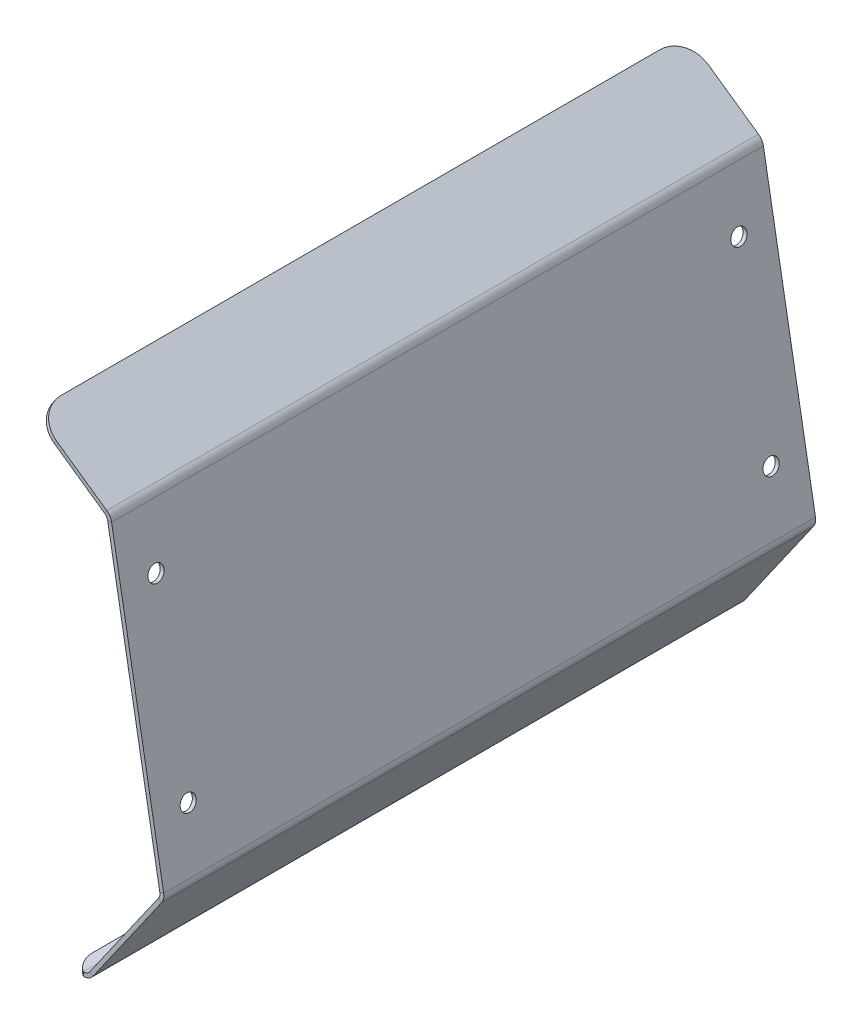
ISO-10303-21;
HEADER;
FILE_DESCRIPTION(('STEP AP214'),'2;1');
FILE_NAME('part.step','',(''),(''),'','','');
FILE_SCHEMA(('AUTOMOTIVE_DESIGN { 1 0 10303 214 1 1 1 1 }'));
ENDSEC;
DATA;
#1=APPLICATION_CONTEXT('core data for automotive mechanical design processes');
#2=APPLICATION_PROTOCOL_DEFINITION('international standard','automotive_design',2000,#1);
#3=PRODUCT_CONTEXT('',#1,'mechanical');
#4=PRODUCT('Part','Part','',(#3));
#5=PRODUCT_RELATED_PRODUCT_CATEGORY('part','',(#4));
#6=PRODUCT_DEFINITION_FORMATION('','',#4);
#7=PRODUCT_DEFINITION_CONTEXT('part definition',#1,'design');
#8=PRODUCT_DEFINITION('design','',#6,#7);
#9=PRODUCT_DEFINITION_SHAPE('','',#8);
#10=(LENGTH_UNIT() NAMED_UNIT(*) SI_UNIT(.MILLI.,.METRE.));
#11=(NAMED_UNIT(*) PLANE_ANGLE_UNIT() SI_UNIT($,.RADIAN.));
#12=(NAMED_UNIT(*) SI_UNIT($,.STERADIAN.) SOLID_ANGLE_UNIT());
#13=UNCERTAINTY_MEASURE_WITH_UNIT(LENGTH_MEASURE(1.E-05),#10,'distance_accuracy_value','');
#14=(GEOMETRIC_REPRESENTATION_CONTEXT(3) GLOBAL_UNCERTAINTY_ASSIGNED_CONTEXT((#13)) GLOBAL_UNIT_ASSIGNED_CONTEXT((#10,
#11,#12)) REPRESENTATION_CONTEXT('',''));
#15=CARTESIAN_POINT('',(0.,0.,0.));
#16=DIRECTION('',(0.,0.,1.));
#17=DIRECTION('',(1.,0.,0.));
#18=AXIS2_PLACEMENT_3D('',#15,#16,#17);
#19=CARTESIAN_POINT('',(148.405860086006,77.6823649230071,245.999999999999));
#20=DIRECTION('',(0.,0.,1.));
#21=DIRECTION('',(1.,0.,0.));
#22=AXIS2_PLACEMENT_3D('',#19,#20,#21);
#23=PLANE('',#22);
#24=DIRECTION('',(0.573576436351058,0.819152044288983,0.));
#25=VECTOR('',#24,1.);
#26=CARTESIAN_POINT('',(148.405860086006,77.6823649230071,245.999999999999));
#27=LINE('',#26,#25);
#28=CARTESIAN_POINT('',(148.405860086006,77.6823649230071,245.999999999999));
#29=VERTEX_POINT('',#28);
#30=CARTESIAN_POINT('',(149.266224740533,78.9110929894406,245.999999999999));
#31=VERTEX_POINT('',#30);
#32=EDGE_CURVE('E328',#29,#31,#27,.T.);
#33=ORIENTED_EDGE('',*,*,#32,.F.);
#34=CARTESIAN_POINT('',(146.685130776953,75.2249087901402,245.999999999999));
#35=DIRECTION('',(0.,0.,1.));
#36=DIRECTION('',(1.,0.,0.));
#37=AXIS2_PLACEMENT_3D('',#34,#35,#36);
#38=CIRCLE('',#37,3.);
#39=CARTESIAN_POINT('',(149.63955403599,75.745853323141,245.999999999999));
#40=VERTEX_POINT('',#39);
#41=EDGE_CURVE('E394',#29,#40,#38,.F.);
#42=ORIENTED_EDGE('',*,*,#41,.T.);
#43=DIRECTION('',(-0.984807753012202,-0.173648177666963,0.));
#44=VECTOR('',#43,1.);
#45=CARTESIAN_POINT('',(151.116765665508,76.0063255896414,245.999999999999));
#46=LINE('',#45,#44);
#47=CARTESIAN_POINT('',(151.116765665508,76.0063255896414,245.999999999999));
#48=VERTEX_POINT('',#47);
#49=EDGE_CURVE('E325',#48,#40,#46,.T.);
#50=ORIENTED_EDGE('',*,*,#49,.F.);
#51=CARTESIAN_POINT('',(146.685130776953,75.2249087901402,245.999999999999));
#52=DIRECTION('',(0.,0.,1.));
#53=DIRECTION('',(1.,0.,0.));
#54=AXIS2_PLACEMENT_3D('',#51,#52,#53);
#55=CIRCLE('',#54,4.5);
#56=EDGE_CURVE('E470',#31,#48,#55,.F.);
#57=ORIENTED_EDGE('',*,*,#56,.F.);
#58=EDGE_LOOP('',(#33,#42,#50,#57));
#59=FACE_BOUND('',#58,.T.);
#60=ADVANCED_FACE('F41',(#59),#23,.T.);
#61=CARTESIAN_POINT('',(151.116765665508,76.0063255896414,245.999999999999));
#62=DIRECTION('',(0.,0.,1.));
#63=DIRECTION('',(1.,0.,0.));
#64=AXIS2_PLACEMENT_3D('',#61,#62,#63);
#65=PLANE('',#64);
#66=DIRECTION('',(0.819152044288987,-0.573576436351053,0.));
#67=VECTOR('',#66,1.);
#68=CARTESIAN_POINT('',(150.284136399703,78.1983435724579,245.999999999999));
#69=LINE('',#68,#67);
#70=CARTESIAN_POINT('',(130.259993063085,92.2193996829498,245.999999999999));
#71=VERTEX_POINT('',#70);
#72=EDGE_CURVE('E553',#71,#31,#69,.T.);
#73=ORIENTED_EDGE('',*,*,#72,.F.);
#74=DIRECTION('',(0.57357643635105,0.819152044288989,0.));
#75=VECTOR('',#74,1.);
#76=CARTESIAN_POINT('',(129.504008144032,91.1397413276773,245.999999999999));
#77=LINE('',#76,#75);
#78=CARTESIAN_POINT('',(129.399628408559,90.9906716165163,245.999999999999));
#79=VERTEX_POINT('',#78);
#80=EDGE_CURVE('E11',#71,#79,#77,.F.);
#81=ORIENTED_EDGE('',*,*,#80,.T.);
#82=DIRECTION('',(0.819152044288987,-0.573576436351053,0.));
#83=VECTOR('',#82,1.);
#84=CARTESIAN_POINT('',(149.423771745177,76.9696155060244,245.999999999999));
#85=LINE('',#84,#83);
#86=EDGE_CURVE('E492',#79,#29,#85,.T.);
#87=ORIENTED_EDGE('',*,*,#86,.T.);
#88=ORIENTED_EDGE('',*,*,#32,.T.);
#89=EDGE_LOOP('',(#73,#81,#87,#88));
#90=FACE_BOUND('',#89,.T.);
#91=ADVANCED_FACE('F526',(#90),#65,.T.);
#92=CARTESIAN_POINT('',(149.63955403599,75.745853323141,0.));
#93=DIRECTION('',(0.,0.,-1.));
#94=DIRECTION('',(-1.,0.,0.));
#95=AXIS2_PLACEMENT_3D('',#92,#93,#94);
#96=PLANE('',#95);
#97=DIRECTION('',(0.984807753012202,0.173648177666963,0.));
#98=VECTOR('',#97,1.);
#99=CARTESIAN_POINT('',(149.63955403599,75.745853323141,0.));
#100=LINE('',#99,#98);
#101=CARTESIAN_POINT('',(149.63955403599,75.745853323141,0.));
#102=VERTEX_POINT('',#101);
#103=CARTESIAN_POINT('',(151.116765665508,76.0063255896414,0.));
#104=VERTEX_POINT('',#103);
#105=EDGE_CURVE('E322',#102,#104,#100,.T.);
#106=ORIENTED_EDGE('',*,*,#105,.F.);
#107=CARTESIAN_POINT('',(146.685130776953,75.2249087901402,0.));
#108=DIRECTION('',(0.,0.,1.));
#109=DIRECTION('',(1.,0.,0.));
#110=AXIS2_PLACEMENT_3D('',#107,#108,#109);
#111=CIRCLE('',#110,3.);
#112=CARTESIAN_POINT('',(148.405860086006,77.6823649230071,0.));
#113=VERTEX_POINT('',#112);
#114=EDGE_CURVE('E258',#113,#102,#111,.F.);
#115=ORIENTED_EDGE('',*,*,#114,.F.);
#116=DIRECTION('',(-0.573576436351058,-0.819152044288983,0.));
#117=VECTOR('',#116,1.);
#118=CARTESIAN_POINT('',(149.266224740533,78.9110929894406,0.));
#119=LINE('',#118,#117);
#120=CARTESIAN_POINT('',(149.266224740533,78.9110929894406,0.));
#121=VERTEX_POINT('',#120);
#122=EDGE_CURVE('E255',#121,#113,#119,.T.);
#123=ORIENTED_EDGE('',*,*,#122,.F.);
#124=CARTESIAN_POINT('',(146.685130776953,75.2249087901402,0.));
#125=DIRECTION('',(0.,0.,1.));
#126=DIRECTION('',(1.,0.,0.));
#127=AXIS2_PLACEMENT_3D('',#124,#125,#126);
#128=CIRCLE('',#127,4.5);
#129=EDGE_CURVE('E453',#121,#104,#128,.F.);
#130=ORIENTED_EDGE('',*,*,#129,.T.);
#131=EDGE_LOOP('',(#106,#115,#123,#130));
#132=FACE_BOUND('',#131,.T.);
#133=ADVANCED_FACE('F396',(#132),#96,.T.);
#134=CARTESIAN_POINT('',(149.266224740533,78.9110929894406,0.));
#135=DIRECTION('',(0.,0.,-1.));
#136=DIRECTION('',(-1.,0.,0.));
#137=AXIS2_PLACEMENT_3D('',#134,#135,#136);
#138=PLANE('',#137);
#139=DIRECTION('',(0.173648177667033,-0.98480775301219,0.));
#140=VECTOR('',#139,1.);
#141=CARTESIAN_POINT('',(169.167035978442,-34.9999999999999,0.));
#142=LINE('',#141,#140);
#143=CARTESIAN_POINT('',(169.298550042963,-35.7458533231406,0.));
#144=VERTEX_POINT('',#143);
#145=EDGE_CURVE('E400',#102,#144,#142,.T.);
#146=ORIENTED_EDGE('',*,*,#145,.F.);
#147=ORIENTED_EDGE('',*,*,#105,.T.);
#148=DIRECTION('',(0.173648177666931,-0.984807753012208,0.));
#149=VECTOR('',#148,1.);
#150=CARTESIAN_POINT('',(170.64424760796,-34.7395277334995,0.));
#151=LINE('',#150,#149);
#152=CARTESIAN_POINT('',(170.775761672481,-35.4853810566401,0.));
#153=VERTEX_POINT('',#152);
#154=EDGE_CURVE('E449',#104,#153,#151,.T.);
#155=ORIENTED_EDGE('',*,*,#154,.T.);
#156=DIRECTION('',(-0.98480775301219,-0.173648177667033,0.));
#157=VECTOR('',#156,1.);
#158=CARTESIAN_POINT('',(170.775761672481,-35.4853810566401,0.));
#159=LINE('',#158,#157);
#160=EDGE_CURVE('E308',#153,#144,#159,.T.);
#161=ORIENTED_EDGE('',*,*,#160,.T.);
#162=EDGE_LOOP('',(#146,#147,#155,#161));
#163=FACE_BOUND('',#162,.T.);
#164=ADVANCED_FACE('F477',(#163),#138,.T.);
#165=CARTESIAN_POINT('',(169.298550042963,-35.7458533231406,245.999999999999));
#166=DIRECTION('',(0.,0.,1.));
#167=DIRECTION('',(1.,0.,0.));
#168=AXIS2_PLACEMENT_3D('',#165,#166,#167);
#169=PLANE('',#168);
#170=DIRECTION('',(0.98480775301219,0.173648177667033,0.));
#171=VECTOR('',#170,1.);
#172=CARTESIAN_POINT('',(169.298550042963,-35.7458533231406,245.999999999999));
#173=LINE('',#172,#171);
#174=CARTESIAN_POINT('',(169.298550042963,-35.7458533231406,245.999999999999));
#175=VERTEX_POINT('',#174);
#176=CARTESIAN_POINT('',(170.775761672481,-35.4853810566401,245.999999999999));
#177=VERTEX_POINT('',#176);
#178=EDGE_CURVE('E317',#175,#177,#173,.T.);
#179=ORIENTED_EDGE('',*,*,#178,.F.);
#180=CARTESIAN_POINT('',(166.344126783926,-36.2667978561417,245.999999999999));
#181=DIRECTION('',(0.,0.,1.));
#182=DIRECTION('',(1.,0.,0.));
#183=AXIS2_PLACEMENT_3D('',#180,#181,#182);
#184=CIRCLE('',#183,3.);
#185=CARTESIAN_POINT('',(168.801582916793,-37.9875271651948,245.999999999999));
#186=VERTEX_POINT('',#185);
#187=EDGE_CURVE('E485',#175,#186,#184,.F.);
#188=ORIENTED_EDGE('',*,*,#187,.T.);
#189=DIRECTION('',(-0.819152044288993,0.573576436351044,0.));
#190=VECTOR('',#189,1.);
#191=CARTESIAN_POINT('',(170.030310983227,-38.8478918197214,245.999999999999));
#192=LINE('',#191,#190);
#193=CARTESIAN_POINT('',(170.030310983227,-38.8478918197214,245.999999999999));
#194=VERTEX_POINT('',#193);
#195=EDGE_CURVE('E314',#194,#186,#192,.T.);
#196=ORIENTED_EDGE('',*,*,#195,.F.);
#197=CARTESIAN_POINT('',(166.344126783926,-36.2667978561417,245.999999999999));
#198=DIRECTION('',(0.,0.,1.));
#199=DIRECTION('',(1.,0.,0.));
#200=AXIS2_PLACEMENT_3D('',#197,#198,#199);
#201=CIRCLE('',#200,4.5);
#202=EDGE_CURVE('E510',#177,#194,#201,.F.);
#203=ORIENTED_EDGE('',*,*,#202,.F.);
#204=EDGE_LOOP('',(#179,#188,#196,#203));
#205=FACE_BOUND('',#204,.T.);
#206=ADVANCED_FACE('F509',(#205),#169,.T.);
#207=CARTESIAN_POINT('',(170.030310983227,-38.8478918197214,245.999999999999));
#208=DIRECTION('',(0.,0.,1.));
#209=DIRECTION('',(1.,0.,0.));
#210=AXIS2_PLACEMENT_3D('',#207,#208,#209);
#211=PLANE('',#210);
#212=DIRECTION('',(0.173648177666931,-0.984807753012208,0.));
#213=VECTOR('',#212,1.);
#214=CARTESIAN_POINT('',(169.167035978442,-34.9999999999999,245.999999999999));
#215=LINE('',#214,#213);
#216=EDGE_CURVE('E482',#40,#175,#215,.T.);
#217=ORIENTED_EDGE('',*,*,#216,.T.);
#218=ORIENTED_EDGE('',*,*,#178,.T.);
#219=DIRECTION('',(0.173648177667033,-0.98480775301219,0.));
#220=VECTOR('',#219,1.);
#221=CARTESIAN_POINT('',(170.64424760796,-34.7395277334993,245.999999999999));
#222=LINE('',#221,#220);
#223=EDGE_CURVE('E513',#48,#177,#222,.T.);
#224=ORIENTED_EDGE('',*,*,#223,.F.);
#225=ORIENTED_EDGE('',*,*,#49,.T.);
#226=EDGE_LOOP('',(#217,#218,#224,#225));
#227=FACE_BOUND('',#226,.T.);
#228=ADVANCED_FACE('F512',(#227),#211,.T.);
#229=CARTESIAN_POINT('',(168.801582916793,-37.9875271651948,0.));
#230=DIRECTION('',(0.,0.,-1.));
#231=DIRECTION('',(-1.,0.,0.));
#232=AXIS2_PLACEMENT_3D('',#229,#230,#231);
#233=PLANE('',#232);
#234=DIRECTION('',(0.819152044288993,-0.573576436351044,0.));
#235=VECTOR('',#234,1.);
#236=CARTESIAN_POINT('',(168.801582916793,-37.9875271651948,0.));
#237=LINE('',#236,#235);
#238=CARTESIAN_POINT('',(168.801582916793,-37.9875271651948,0.));
#239=VERTEX_POINT('',#238);
#240=CARTESIAN_POINT('',(170.030310983227,-38.8478918197214,0.));
#241=VERTEX_POINT('',#240);
#242=EDGE_CURVE('E311',#239,#241,#237,.T.);
#243=ORIENTED_EDGE('',*,*,#242,.F.);
#244=CARTESIAN_POINT('',(166.344126783926,-36.2667978561417,0.));
#245=DIRECTION('',(0.,0.,1.));
#246=DIRECTION('',(1.,0.,0.));
#247=AXIS2_PLACEMENT_3D('',#244,#245,#246);
#248=CIRCLE('',#247,3.);
#249=EDGE_CURVE('E366',#144,#239,#248,.F.);
#250=ORIENTED_EDGE('',*,*,#249,.F.);
#251=ORIENTED_EDGE('',*,*,#160,.F.);
#252=CARTESIAN_POINT('',(166.344126783926,-36.2667978561417,0.));
#253=DIRECTION('',(0.,0.,1.));
#254=DIRECTION('',(1.,0.,0.));
#255=AXIS2_PLACEMENT_3D('',#252,#253,#254);
#256=CIRCLE('',#255,4.5);
#257=EDGE_CURVE('E439',#153,#241,#256,.F.);
#258=ORIENTED_EDGE('',*,*,#257,.T.);
#259=EDGE_LOOP('',(#243,#250,#251,#258));
#260=FACE_BOUND('',#259,.T.);
#261=ADVANCED_FACE('F516',(#260),#233,.T.);
#262=CARTESIAN_POINT('',(170.775761672481,-35.4853810566401,0.));
#263=DIRECTION('',(0.,0.,-1.));
#264=DIRECTION('',(-1.,0.,0.));
#265=AXIS2_PLACEMENT_3D('',#262,#263,#264);
#266=PLANE('',#265);
#267=DIRECTION('',(-0.573576436351041,-0.819152044288995,0.));
#268=VECTOR('',#267,1.);
#269=CARTESIAN_POINT('',(169.514332333776,-36.9696155060243,0.));
#270=LINE('',#269,#268);
#271=CARTESIAN_POINT('',(142.901222697,-74.977074986995,0.));
#272=VERTEX_POINT('',#271);
#273=EDGE_CURVE('E361',#239,#272,#270,.T.);
#274=ORIENTED_EDGE('',*,*,#273,.F.);
#275=ORIENTED_EDGE('',*,*,#242,.T.);
#276=DIRECTION('',(-0.573576436351041,-0.819152044288995,0.));
#277=VECTOR('',#276,1.);
#278=CARTESIAN_POINT('',(170.743060400209,-37.8299801605508,0.));
#279=LINE('',#278,#277);
#280=CARTESIAN_POINT('',(144.129950763434,-75.8374396415216,0.));
#281=VERTEX_POINT('',#280);
#282=EDGE_CURVE('E427',#241,#281,#279,.T.);
#283=ORIENTED_EDGE('',*,*,#282,.T.);
#284=DIRECTION('',(-0.819152044288993,0.573576436351044,0.));
#285=VECTOR('',#284,1.);
#286=CARTESIAN_POINT('',(144.129950763434,-75.8374396415216,0.));
#287=LINE('',#286,#285);
#288=EDGE_CURVE('E300',#281,#272,#287,.T.);
#289=ORIENTED_EDGE('',*,*,#288,.T.);
#290=EDGE_LOOP('',(#274,#275,#283,#289));
#291=FACE_BOUND('',#290,.T.);
#292=ADVANCED_FACE('F424',(#291),#266,.T.);
#293=CARTESIAN_POINT('',(142.901222697,-74.977074986995,245.999999999999));
#294=DIRECTION('',(0.,0.,1.));
#295=DIRECTION('',(1.,0.,0.));
#296=AXIS2_PLACEMENT_3D('',#293,#294,#295);
#297=PLANE('',#296);
#298=DIRECTION('',(0.819152044288993,-0.573576436351044,0.));
#299=VECTOR('',#298,1.);
#300=CARTESIAN_POINT('',(142.901222697,-74.977074986995,245.999999999999));
#301=LINE('',#300,#299);
#302=CARTESIAN_POINT('',(142.901222697,-74.977074986995,245.999999999999));
#303=VERTEX_POINT('',#302);
#304=CARTESIAN_POINT('',(144.129950763434,-75.8374396415216,245.999999999999));
#305=VERTEX_POINT('',#304);
#306=EDGE_CURVE('E181',#303,#305,#301,.T.);
#307=ORIENTED_EDGE('',*,*,#306,.F.);
#308=CARTESIAN_POINT('',(140.443766564133,-73.2563456779419,245.999999999999));
#309=DIRECTION('',(0.,0.,1.));
#310=DIRECTION('',(1.,0.,0.));
#311=AXIS2_PLACEMENT_3D('',#308,#309,#310);
#312=CIRCLE('',#311,3.);
#313=CARTESIAN_POINT('',(140.443766564133,-76.2563456779419,245.999999999999));
#314=VERTEX_POINT('',#313);
#315=EDGE_CURVE('E176',#303,#314,#312,.F.);
#316=ORIENTED_EDGE('',*,*,#315,.T.);
#317=DIRECTION('',(0.,1.,0.));
#318=VECTOR('',#317,1.);
#319=CARTESIAN_POINT('',(140.443766564133,-77.7563456779419,245.999999999999));
#320=LINE('',#319,#318);
#321=CARTESIAN_POINT('',(140.443766564133,-77.7563456779419,245.999999999999));
#322=VERTEX_POINT('',#321);
#323=EDGE_CURVE('E169',#322,#314,#320,.T.);
#324=ORIENTED_EDGE('',*,*,#323,.F.);
#325=CARTESIAN_POINT('',(140.443766564133,-73.2563456779419,245.999999999999));
#326=DIRECTION('',(0.,0.,1.));
#327=DIRECTION('',(1.,0.,0.));
#328=AXIS2_PLACEMENT_3D('',#325,#326,#327);
#329=CIRCLE('',#328,4.5);
#330=EDGE_CURVE('E173',#305,#322,#329,.F.);
#331=ORIENTED_EDGE('',*,*,#330,.F.);
#332=EDGE_LOOP('',(#307,#316,#324,#331));
#333=FACE_BOUND('',#332,.T.);
#334=ADVANCED_FACE('F171',(#333),#297,.T.);
#335=CARTESIAN_POINT('',(140.443766564133,-77.7563456779419,245.999999999999));
#336=DIRECTION('',(0.,0.,1.));
#337=DIRECTION('',(1.,0.,0.));
#338=AXIS2_PLACEMENT_3D('',#335,#336,#337);
#339=PLANE('',#338);
#340=DIRECTION('',(-0.573576436351041,-0.819152044288995,0.));
#341=VECTOR('',#340,1.);
#342=CARTESIAN_POINT('',(169.514332333776,-36.9696155060243,245.999999999999));
#343=LINE('',#342,#341);
#344=EDGE_CURVE('E422',#186,#303,#343,.T.);
#345=ORIENTED_EDGE('',*,*,#344,.T.);
#346=ORIENTED_EDGE('',*,*,#306,.T.);
#347=DIRECTION('',(-0.573576436351041,-0.819152044288995,0.));
#348=VECTOR('',#347,1.);
#349=CARTESIAN_POINT('',(170.743060400209,-37.8299801605508,245.999999999999));
#350=LINE('',#349,#348);
#351=EDGE_CURVE('E204',#194,#305,#350,.T.);
#352=ORIENTED_EDGE('',*,*,#351,.F.);
#353=ORIENTED_EDGE('',*,*,#195,.T.);
#354=EDGE_LOOP('',(#345,#346,#352,#353));
#355=FACE_BOUND('',#354,.T.);
#356=ADVANCED_FACE('F505',(#355),#339,.T.);
#357=CARTESIAN_POINT('',(140.443766564133,-76.2563456779419,0.));
#358=DIRECTION('',(0.,0.,-1.));
#359=DIRECTION('',(-1.,0.,0.));
#360=AXIS2_PLACEMENT_3D('',#357,#358,#359);
#361=PLANE('',#360);
#362=DIRECTION('',(0.,-1.,0.));
#363=VECTOR('',#362,1.);
#364=CARTESIAN_POINT('',(140.443766564133,-76.2563456779419,0.));
#365=LINE('',#364,#363);
#366=CARTESIAN_POINT('',(140.443766564133,-76.2563456779419,0.));
#367=VERTEX_POINT('',#366);
#368=CARTESIAN_POINT('',(140.443766564133,-77.7563456779419,0.));
#369=VERTEX_POINT('',#368);
#370=EDGE_CURVE('E182',#367,#369,#365,.T.);
#371=ORIENTED_EDGE('',*,*,#370,.F.);
#372=CARTESIAN_POINT('',(140.443766564133,-73.2563456779419,0.));
#373=DIRECTION('',(0.,0.,1.));
#374=DIRECTION('',(1.,0.,0.));
#375=AXIS2_PLACEMENT_3D('',#372,#373,#374);
#376=CIRCLE('',#375,3.);
#377=EDGE_CURVE('E205',#272,#367,#376,.F.);
#378=ORIENTED_EDGE('',*,*,#377,.F.);
#379=ORIENTED_EDGE('',*,*,#288,.F.);
#380=CARTESIAN_POINT('',(140.443766564133,-73.2563456779419,0.));
#381=DIRECTION('',(0.,0.,1.));
#382=DIRECTION('',(1.,0.,0.));
#383=AXIS2_PLACEMENT_3D('',#380,#381,#382);
#384=CIRCLE('',#383,4.5);
#385=EDGE_CURVE('E354',#281,#369,#384,.F.);
#386=ORIENTED_EDGE('',*,*,#385,.T.);
#387=EDGE_LOOP('',(#371,#378,#379,#386));
#388=FACE_BOUND('',#387,.T.);
#389=ADVANCED_FACE('F353',(#388),#361,.T.);
#390=CARTESIAN_POINT('',(142.005467715789,-76.2563456779419,245.999999999999));
#391=DIRECTION('',(0.,-1.,0.));
#392=DIRECTION('',(1.,0.,0.));
#393=AXIS2_PLACEMENT_3D('',#390,#391,#392);
#394=PLANE('',#393);
#395=DIRECTION('',(0.,0.,-1.));
#396=VECTOR('',#395,1.);
#397=CARTESIAN_POINT('',(140.443766564133,-76.2563456779419,245.999999999999));
#398=LINE('',#397,#396);
#399=EDGE_CURVE('E346',#314,#367,#398,.T.);
#400=ORIENTED_EDGE('',*,*,#399,.T.);
#401=CARTESIAN_POINT('',(145.953063944536,-76.2563456779418,8.34551630363785));
#402=DIRECTION('',(0.,-1.,0.));
#403=DIRECTION('',(1.,0.,0.));
#404=AXIS2_PLACEMENT_3D('',#401,#402,#403);
#405=CIRCLE('',#404,10.);
#406=CARTESIAN_POINT('',(135.953063944536,-76.2563456779419,8.34551630363783));
#407=VERTEX_POINT('',#406);
#408=EDGE_CURVE('E335',#367,#407,#405,.F.);
#409=ORIENTED_EDGE('',*,*,#408,.T.);
#410=DIRECTION('',(0.,0.,-1.));
#411=VECTOR('',#410,1.);
#412=CARTESIAN_POINT('',(135.953063944536,-76.2563456779419,245.999999999999));
#413=LINE('',#412,#411);
#414=CARTESIAN_POINT('',(135.953063944536,-76.2563456779419,237.654483696361));
#415=VERTEX_POINT('',#414);
#416=EDGE_CURVE('E296',#415,#407,#413,.T.);
#417=ORIENTED_EDGE('',*,*,#416,.F.);
#418=CARTESIAN_POINT('',(145.953063944536,-76.2563456779418,237.654483696361));
#419=DIRECTION('',(0.,-1.,0.));
#420=DIRECTION('',(1.,0.,0.));
#421=AXIS2_PLACEMENT_3D('',#418,#419,#420);
#422=CIRCLE('',#421,10.);
#423=EDGE_CURVE('E332',#415,#314,#422,.F.);
#424=ORIENTED_EDGE('',*,*,#423,.T.);
#425=EDGE_LOOP('',(#400,#409,#417,#424));
#426=FACE_BOUND('',#425,.T.);
#427=ADVANCED_FACE('F345',(#426),#394,.F.);
#428=CARTESIAN_POINT('',(135.953063944536,-77.7563456779419,245.999999999999));
#429=DIRECTION('',(-1.,0.,0.));
#430=DIRECTION('',(0.,0.,1.));
#431=AXIS2_PLACEMENT_3D('',#428,#429,#430);
#432=PLANE('',#431);
#433=ORIENTED_EDGE('',*,*,#416,.T.);
#434=DIRECTION('',(0.,1.,0.));
#435=VECTOR('',#434,1.);
#436=CARTESIAN_POINT('',(135.953063944536,-77.7563456779419,8.34551630363785));
#437=LINE('',#436,#435);
#438=CARTESIAN_POINT('',(135.953063944536,-77.7563456779419,8.34551630363785));
#439=VERTEX_POINT('',#438);
#440=EDGE_CURVE('E212',#407,#439,#437,.F.);
#441=ORIENTED_EDGE('',*,*,#440,.T.);
#442=DIRECTION('',(0.,0.,-1.));
#443=VECTOR('',#442,1.);
#444=CARTESIAN_POINT('',(135.953063944536,-77.7563456779419,245.999999999999));
#445=LINE('',#444,#443);
#446=CARTESIAN_POINT('',(135.953063944536,-77.7563456779419,237.654483696361));
#447=VERTEX_POINT('',#446);
#448=EDGE_CURVE('E197',#447,#439,#445,.T.);
#449=ORIENTED_EDGE('',*,*,#448,.F.);
#450=DIRECTION('',(0.,-1.,0.));
#451=VECTOR('',#450,1.);
#452=CARTESIAN_POINT('',(135.953063944536,-76.2563456779419,237.654483696361));
#453=LINE('',#452,#451);
#454=EDGE_CURVE('E210',#447,#415,#453,.F.);
#455=ORIENTED_EDGE('',*,*,#454,.T.);
#456=EDGE_LOOP('',(#433,#441,#449,#455));
#457=FACE_BOUND('',#456,.T.);
#458=ADVANCED_FACE('F341',(#457),#432,.T.);
#459=CARTESIAN_POINT('',(142.005467715789,-77.7563456779419,245.999999999999));
#460=DIRECTION('',(0.,-1.,0.));
#461=DIRECTION('',(1.,0.,0.));
#462=AXIS2_PLACEMENT_3D('',#459,#460,#461);
#463=PLANE('',#462);
#464=ORIENTED_EDGE('',*,*,#448,.T.);
#465=CARTESIAN_POINT('',(145.953063944536,-77.7563456779418,8.34551630363785));
#466=DIRECTION('',(0.,-1.,0.));
#467=DIRECTION('',(1.,0.,0.));
#468=AXIS2_PLACEMENT_3D('',#465,#466,#467);
#469=CIRCLE('',#468,10.);
#470=EDGE_CURVE('E192',#439,#369,#469,.T.);
#471=ORIENTED_EDGE('',*,*,#470,.T.);
#472=DIRECTION('',(0.,0.,-1.));
#473=VECTOR('',#472,1.);
#474=CARTESIAN_POINT('',(140.443766564133,-77.7563456779419,245.999999999999));
#475=LINE('',#474,#473);
#476=EDGE_CURVE('E186',#322,#369,#475,.T.);
#477=ORIENTED_EDGE('',*,*,#476,.F.);
#478=CARTESIAN_POINT('',(145.953063944536,-77.7563456779418,237.654483696361));
#479=DIRECTION('',(0.,-1.,0.));
#480=DIRECTION('',(1.,0.,0.));
#481=AXIS2_PLACEMENT_3D('',#478,#479,#480);
#482=CIRCLE('',#481,10.);
#483=EDGE_CURVE('E189',#322,#447,#482,.T.);
#484=ORIENTED_EDGE('',*,*,#483,.T.);
#485=EDGE_LOOP('',(#464,#471,#477,#484));
#486=FACE_BOUND('',#485,.T.);
#487=ADVANCED_FACE('F188',(#486),#463,.T.);
#488=CARTESIAN_POINT('',(140.443766564133,-73.2563456779419,245.999999999999));
#489=DIRECTION('',(0.,0.,-1.));
#490=DIRECTION('',(-1.,0.,0.));
#491=AXIS2_PLACEMENT_3D('',#488,#489,#490);
#492=CYLINDRICAL_SURFACE('',#491,4.5);
#493=ORIENTED_EDGE('',*,*,#385,.F.);
#494=DIRECTION('',(0.,0.,-1.));
#495=VECTOR('',#494,1.);
#496=CARTESIAN_POINT('',(144.129950763434,-75.8374396415216,245.999999999999));
#497=LINE('',#496,#495);
#498=EDGE_CURVE('E198',#305,#281,#497,.T.);
#499=ORIENTED_EDGE('',*,*,#498,.F.);
#500=ORIENTED_EDGE('',*,*,#330,.T.);
#501=ORIENTED_EDGE('',*,*,#476,.T.);
#502=EDGE_LOOP('',(#493,#499,#500,#501));
#503=FACE_BOUND('',#502,.T.);
#504=ADVANCED_FACE('F201',(#503),#492,.T.);
#505=CARTESIAN_POINT('',(170.743060400209,-37.8299801605508,245.999999999999));
#506=DIRECTION('',(0.819152044288995,-0.573576436351041,0.));
#507=DIRECTION('',(0.573576436351041,0.819152044288995,0.));
#508=AXIS2_PLACEMENT_3D('',#505,#506,#507);
#509=PLANE('',#508);
#510=ORIENTED_EDGE('',*,*,#282,.F.);
#511=DIRECTION('',(0.,0.,-1.));
#512=VECTOR('',#511,1.);
#513=CARTESIAN_POINT('',(170.030310983227,-38.8478918197214,245.999999999999));
#514=LINE('',#513,#512);
#515=EDGE_CURVE('E288',#194,#241,#514,.T.);
#516=ORIENTED_EDGE('',*,*,#515,.F.);
#517=ORIENTED_EDGE('',*,*,#351,.T.);
#518=ORIENTED_EDGE('',*,*,#498,.T.);
#519=EDGE_LOOP('',(#510,#516,#517,#518));
#520=FACE_BOUND('',#519,.T.);
#521=ADVANCED_FACE('F429',(#520),#509,.T.);
#522=CARTESIAN_POINT('',(166.344126783926,-36.2667978561417,245.999999999999));
#523=DIRECTION('',(0.,0.,-1.));
#524=DIRECTION('',(-1.,0.,0.));
#525=AXIS2_PLACEMENT_3D('',#522,#523,#524);
#526=CYLINDRICAL_SURFACE('',#525,4.5);
#527=ORIENTED_EDGE('',*,*,#257,.F.);
#528=DIRECTION('',(0.,0.,-1.));
#529=VECTOR('',#528,1.);
#530=CARTESIAN_POINT('',(170.775761672481,-35.4853810566401,245.999999999999));
#531=LINE('',#530,#529);
#532=EDGE_CURVE('E284',#177,#153,#531,.T.);
#533=ORIENTED_EDGE('',*,*,#532,.F.);
#534=ORIENTED_EDGE('',*,*,#202,.T.);
#535=ORIENTED_EDGE('',*,*,#515,.T.);
#536=EDGE_LOOP('',(#527,#533,#534,#535));
#537=FACE_BOUND('',#536,.T.);
#538=ADVANCED_FACE('F515',(#537),#526,.T.);
#539=CARTESIAN_POINT('',(170.64424760796,-34.7395277334995,245.999999999999));
#540=DIRECTION('',(0.984807753012208,0.173648177666931,0.));
#541=DIRECTION('',(-0.173648177666931,0.984807753012208,0.));
#542=AXIS2_PLACEMENT_3D('',#539,#540,#541);
#543=PLANE('',#542);
#544=CARTESIAN_POINT('',(154.868577450652,54.728743621928,13.0000000000002));
#545=DIRECTION('',(0.984807753012208,0.173648177666931,0.));
#546=DIRECTION('',(-0.173648177666931,0.984807753012208,0.));
#547=AXIS2_PLACEMENT_3D('',#544,#545,#546);
#548=CIRCLE('',#547,3.);
#549=CARTESIAN_POINT('',(154.347632917651,57.6831668809646,13.0000000000002));
#550=VERTEX_POINT('',#549);
#551=EDGE_CURVE('E570',#550,#550,#548,.T.);
#552=ORIENTED_EDGE('',*,*,#551,.F.);
#553=EDGE_LOOP('',(#552));
#554=FACE_BOUND('',#553,.T.);
#555=CARTESIAN_POINT('',(167.023949887337,-14.2077990889266,13.0000000000001));
#556=DIRECTION('',(0.984807753012208,0.173648177666931,0.));
#557=DIRECTION('',(-0.173648177666931,0.984807753012208,0.));
#558=AXIS2_PLACEMENT_3D('',#555,#556,#557);
#559=CIRCLE('',#558,3.);
#560=CARTESIAN_POINT('',(166.503005354336,-11.25337582989,13.0000000000001));
#561=VERTEX_POINT('',#560);
#562=EDGE_CURVE('E578',#561,#561,#559,.T.);
#563=ORIENTED_EDGE('',*,*,#562,.F.);
#564=EDGE_LOOP('',(#563));
#565=FACE_BOUND('',#564,.T.);
#566=CARTESIAN_POINT('',(167.023949887337,-14.2077990889267,232.999999999999));
#567=DIRECTION('',(0.984807753012208,0.173648177666931,0.));
#568=DIRECTION('',(-0.173648177666931,0.984807753012208,0.));
#569=AXIS2_PLACEMENT_3D('',#566,#567,#568);
#570=CIRCLE('',#569,2.99999999999999);
#571=CARTESIAN_POINT('',(166.503005354336,-11.2533758298901,232.999999999999));
#572=VERTEX_POINT('',#571);
#573=EDGE_CURVE('E586',#572,#572,#570,.T.);
#574=ORIENTED_EDGE('',*,*,#573,.F.);
#575=EDGE_LOOP('',(#574));
#576=FACE_BOUND('',#575,.T.);
#577=CARTESIAN_POINT('',(154.868577450652,54.7287436219279,232.999999999999));
#578=DIRECTION('',(0.984807753012208,0.173648177666931,0.));
#579=DIRECTION('',(-0.173648177666931,0.984807753012208,0.));
#580=AXIS2_PLACEMENT_3D('',#577,#578,#579);
#581=CIRCLE('',#580,3.);
#582=CARTESIAN_POINT('',(154.347632917651,57.6831668809645,232.999999999999));
#583=VERTEX_POINT('',#582);
#584=EDGE_CURVE('E442',#583,#583,#581,.T.);
#585=ORIENTED_EDGE('',*,*,#584,.F.);
#586=EDGE_LOOP('',(#585));
#587=FACE_BOUND('',#586,.T.);
#588=ORIENTED_EDGE('',*,*,#154,.F.);
#589=DIRECTION('',(0.,0.,-1.));
#590=VECTOR('',#589,1.);
#591=CARTESIAN_POINT('',(151.116765665508,76.0063255896414,245.999999999999));
#592=LINE('',#591,#590);
#593=EDGE_CURVE('E275',#48,#104,#592,.T.);
#594=ORIENTED_EDGE('',*,*,#593,.F.);
#595=ORIENTED_EDGE('',*,*,#223,.T.);
#596=ORIENTED_EDGE('',*,*,#532,.T.);
#597=EDGE_LOOP('',(#588,#594,#595,#596));
#598=FACE_BOUND('',#597,.T.);
#599=ADVANCED_FACE('F473',(#554,#565,#576,#587,#598),#543,.T.);
#600=CARTESIAN_POINT('',(146.685130776953,75.2249087901402,245.999999999999));
#601=DIRECTION('',(0.,0.,-1.));
#602=DIRECTION('',(-1.,0.,0.));
#603=AXIS2_PLACEMENT_3D('',#600,#601,#602);
#604=CYLINDRICAL_SURFACE('',#603,4.5);
#605=ORIENTED_EDGE('',*,*,#129,.F.);
#606=DIRECTION('',(0.,0.,-1.));
#607=VECTOR('',#606,1.);
#608=CARTESIAN_POINT('',(149.266224740533,78.9110929894406,245.999999999999));
#609=LINE('',#608,#607);
#610=EDGE_CURVE('E270',#31,#121,#609,.T.);
#611=ORIENTED_EDGE('',*,*,#610,.F.);
#612=ORIENTED_EDGE('',*,*,#56,.T.);
#613=ORIENTED_EDGE('',*,*,#593,.T.);
#614=EDGE_LOOP('',(#605,#611,#612,#613));
#615=FACE_BOUND('',#614,.T.);
#616=ADVANCED_FACE('F465',(#615),#604,.T.);
#617=CARTESIAN_POINT('',(150.284136399703,78.1983435724579,245.999999999999));
#618=DIRECTION('',(0.573576436351053,0.819152044288987,0.));
#619=DIRECTION('',(-0.819152044288987,0.573576436351053,0.));
#620=AXIS2_PLACEMENT_3D('',#617,#618,#619);
#621=PLANE('',#620);
#622=DIRECTION('',(0.819152044288987,-0.573576436351053,0.));
#623=VECTOR('',#622,1.);
#624=CARTESIAN_POINT('',(150.284136399703,78.1983435724579,0.));
#625=LINE('',#624,#623);
#626=CARTESIAN_POINT('',(130.259993063085,92.2193996829498,0.));
#627=VERTEX_POINT('',#626);
#628=EDGE_CURVE('E259',#627,#121,#625,.T.);
#629=ORIENTED_EDGE('',*,*,#628,.F.);
#630=CARTESIAN_POINT('',(130.259993063085,92.2193996829498,10.));
#631=DIRECTION('',(0.573576436351053,0.819152044288987,0.));
#632=DIRECTION('',(-0.819152044288987,0.573576436351053,0.));
#633=AXIS2_PLACEMENT_3D('',#630,#631,#632);
#634=CIRCLE('',#633,10.);
#635=CARTESIAN_POINT('',(122.068472620195,97.9551640464603,10.));
#636=VERTEX_POINT('',#635);
#637=EDGE_CURVE('E228',#627,#636,#634,.T.);
#638=ORIENTED_EDGE('',*,*,#637,.T.);
#639=DIRECTION('',(0.,0.,-1.));
#640=VECTOR('',#639,1.);
#641=CARTESIAN_POINT('',(122.068472620195,97.9551640464603,245.999999999999));
#642=LINE('',#641,#640);
#643=CARTESIAN_POINT('',(122.068472620195,97.9551640464603,235.999999999999));
#644=VERTEX_POINT('',#643);
#645=EDGE_CURVE('E265',#644,#636,#642,.T.);
#646=ORIENTED_EDGE('',*,*,#645,.F.);
#647=CARTESIAN_POINT('',(130.259993063085,92.2193996829497,235.999999999999));
#648=DIRECTION('',(0.573576436351053,0.819152044288987,0.));
#649=DIRECTION('',(-0.819152044288987,0.573576436351053,0.));
#650=AXIS2_PLACEMENT_3D('',#647,#648,#649);
#651=CIRCLE('',#650,10.);
#652=EDGE_CURVE('E225',#644,#71,#651,.T.);
#653=ORIENTED_EDGE('',*,*,#652,.T.);
#654=ORIENTED_EDGE('',*,*,#72,.T.);
#655=ORIENTED_EDGE('',*,*,#610,.T.);
#656=EDGE_LOOP('',(#629,#638,#646,#653,#654,#655));
#657=FACE_BOUND('',#656,.T.);
#658=ADVANCED_FACE('F264',(#657),#621,.T.);
#659=CARTESIAN_POINT('',(121.208107965669,96.7264359800268,245.999999999999));
#660=DIRECTION('',(-0.819152044288989,0.57357643635105,0.));
#661=DIRECTION('',(-0.57357643635105,-0.819152044288989,0.));
#662=AXIS2_PLACEMENT_3D('',#659,#660,#661);
#663=PLANE('',#662);
#664=ORIENTED_EDGE('',*,*,#645,.T.);
#665=DIRECTION('',(0.57357643635105,0.819152044288989,0.));
#666=VECTOR('',#665,1.);
#667=CARTESIAN_POINT('',(121.208107965669,96.7264359800268,10.));
#668=LINE('',#667,#666);
#669=CARTESIAN_POINT('',(121.208107965669,96.7264359800268,10.));
#670=VERTEX_POINT('',#669);
#671=EDGE_CURVE('E63',#636,#670,#668,.F.);
#672=ORIENTED_EDGE('',*,*,#671,.T.);
#673=DIRECTION('',(0.,0.,-1.));
#674=VECTOR('',#673,1.);
#675=CARTESIAN_POINT('',(121.208107965669,96.7264359800268,245.999999999999));
#676=LINE('',#675,#674);
#677=CARTESIAN_POINT('',(121.208107965669,96.7264359800268,235.999999999999));
#678=VERTEX_POINT('',#677);
#679=EDGE_CURVE('E248',#678,#670,#676,.T.);
#680=ORIENTED_EDGE('',*,*,#679,.F.);
#681=DIRECTION('',(0.57357643635105,0.819152044288989,0.));
#682=VECTOR('',#681,1.);
#683=CARTESIAN_POINT('',(121.208107965669,96.7264359800268,235.999999999999));
#684=LINE('',#683,#682);
#685=EDGE_CURVE('E231',#678,#644,#684,.T.);
#686=ORIENTED_EDGE('',*,*,#685,.T.);
#687=EDGE_LOOP('',(#664,#672,#680,#686));
#688=FACE_BOUND('',#687,.T.);
#689=ADVANCED_FACE('F267',(#688),#663,.T.);
#690=CARTESIAN_POINT('',(149.423771745177,76.9696155060244,245.999999999999));
#691=DIRECTION('',(0.573576436351053,0.819152044288987,0.));
#692=DIRECTION('',(-0.819152044288987,0.573576436351053,0.));
#693=AXIS2_PLACEMENT_3D('',#690,#691,#692);
#694=PLANE('',#693);
#695=ORIENTED_EDGE('',*,*,#679,.T.);
#696=CARTESIAN_POINT('',(129.399628408559,90.9906716165163,10.));
#697=DIRECTION('',(0.573576436351053,0.819152044288987,0.));
#698=DIRECTION('',(-0.819152044288987,0.573576436351053,0.));
#699=AXIS2_PLACEMENT_3D('',#696,#697,#698);
#700=CIRCLE('',#699,10.);
#701=CARTESIAN_POINT('',(129.399628408559,90.9906716165163,0.));
#702=VERTEX_POINT('',#701);
#703=EDGE_CURVE('E50',#670,#702,#700,.F.);
#704=ORIENTED_EDGE('',*,*,#703,.T.);
#705=DIRECTION('',(0.819152044288987,-0.573576436351053,0.));
#706=VECTOR('',#705,1.);
#707=CARTESIAN_POINT('',(149.423771745177,76.9696155060244,0.));
#708=LINE('',#707,#706);
#709=EDGE_CURVE('E246',#702,#113,#708,.T.);
#710=ORIENTED_EDGE('',*,*,#709,.T.);
#711=DIRECTION('',(0.,0.,-1.));
#712=VECTOR('',#711,1.);
#713=CARTESIAN_POINT('',(148.405860086006,77.6823649230071,245.999999999999));
#714=LINE('',#713,#712);
#715=EDGE_CURVE('E277',#29,#113,#714,.T.);
#716=ORIENTED_EDGE('',*,*,#715,.F.);
#717=ORIENTED_EDGE('',*,*,#86,.F.);
#718=CARTESIAN_POINT('',(129.399628408559,90.9906716165163,235.999999999999));
#719=DIRECTION('',(0.573576436351053,0.819152044288987,0.));
#720=DIRECTION('',(-0.819152044288987,0.573576436351053,0.));
#721=AXIS2_PLACEMENT_3D('',#718,#719,#720);
#722=CIRCLE('',#721,10.);
#723=EDGE_CURVE('E237',#79,#678,#722,.F.);
#724=ORIENTED_EDGE('',*,*,#723,.T.);
#725=EDGE_LOOP('',(#695,#704,#710,#716,#717,#724));
#726=FACE_BOUND('',#725,.T.);
#727=ADVANCED_FACE('F244',(#726),#694,.F.);
#728=CARTESIAN_POINT('',(146.685130776953,75.2249087901402,245.999999999999));
#729=DIRECTION('',(0.,0.,-1.));
#730=DIRECTION('',(-1.,0.,0.));
#731=AXIS2_PLACEMENT_3D('',#728,#729,#730);
#732=CYLINDRICAL_SURFACE('',#731,3.);
#733=ORIENTED_EDGE('',*,*,#114,.T.);
#734=DIRECTION('',(0.,0.,-1.));
#735=VECTOR('',#734,1.);
#736=CARTESIAN_POINT('',(149.63955403599,75.745853323141,245.999999999999));
#737=LINE('',#736,#735);
#738=EDGE_CURVE('E382',#40,#102,#737,.T.);
#739=ORIENTED_EDGE('',*,*,#738,.F.);
#740=ORIENTED_EDGE('',*,*,#41,.F.);
#741=ORIENTED_EDGE('',*,*,#715,.T.);
#742=EDGE_LOOP('',(#733,#739,#740,#741));
#743=FACE_BOUND('',#742,.T.);
#744=ADVANCED_FACE('F391',(#743),#732,.F.);
#745=CARTESIAN_POINT('',(169.167035978442,-34.9999999999999,245.999999999999));
#746=DIRECTION('',(0.98480775301219,0.173648177667033,0.));
#747=DIRECTION('',(-0.173648177667033,0.98480775301219,0.));
#748=AXIS2_PLACEMENT_3D('',#745,#746,#747);
#749=PLANE('',#748);
#750=CARTESIAN_POINT('',(153.391365821134,54.4682713554276,13.0000000000002));
#751=DIRECTION('',(0.984807753012208,0.173648177666931,0.));
#752=DIRECTION('',(-0.173648177666931,0.984807753012208,0.));
#753=AXIS2_PLACEMENT_3D('',#750,#751,#752);
#754=CIRCLE('',#753,3.);
#755=CARTESIAN_POINT('',(152.870421288133,57.4226946144642,13.0000000000002));
#756=VERTEX_POINT('',#755);
#757=EDGE_CURVE('E574',#756,#756,#754,.T.);
#758=ORIENTED_EDGE('',*,*,#757,.T.);
#759=EDGE_LOOP('',(#758));
#760=FACE_BOUND('',#759,.T.);
#761=CARTESIAN_POINT('',(165.546738257819,-14.468271355427,13.0000000000001));
#762=DIRECTION('',(0.984807753012208,0.173648177666931,0.));
#763=DIRECTION('',(-0.173648177666931,0.984807753012208,0.));
#764=AXIS2_PLACEMENT_3D('',#761,#762,#763);
#765=CIRCLE('',#764,3.);
#766=CARTESIAN_POINT('',(165.025793724818,-11.5138480963904,13.0000000000001));
#767=VERTEX_POINT('',#766);
#768=EDGE_CURVE('E582',#767,#767,#765,.T.);
#769=ORIENTED_EDGE('',*,*,#768,.T.);
#770=EDGE_LOOP('',(#769));
#771=FACE_BOUND('',#770,.T.);
#772=CARTESIAN_POINT('',(165.546738257819,-14.4682713554271,232.999999999999));
#773=DIRECTION('',(0.984807753012208,0.173648177666931,0.));
#774=DIRECTION('',(-0.173648177666931,0.984807753012208,0.));
#775=AXIS2_PLACEMENT_3D('',#772,#773,#774);
#776=CIRCLE('',#775,2.99999999999999);
#777=CARTESIAN_POINT('',(165.025793724818,-11.5138480963905,232.999999999999));
#778=VERTEX_POINT('',#777);
#779=EDGE_CURVE('E568',#778,#778,#776,.T.);
#780=ORIENTED_EDGE('',*,*,#779,.T.);
#781=EDGE_LOOP('',(#780));
#782=FACE_BOUND('',#781,.T.);
#783=CARTESIAN_POINT('',(153.391365821134,54.4682713554275,232.999999999999));
#784=DIRECTION('',(0.984807753012208,0.173648177666931,0.));
#785=DIRECTION('',(-0.173648177666931,0.984807753012208,0.));
#786=AXIS2_PLACEMENT_3D('',#783,#784,#785);
#787=CIRCLE('',#786,3.);
#788=CARTESIAN_POINT('',(152.870421288133,57.4226946144641,232.999999999999));
#789=VERTEX_POINT('',#788);
#790=EDGE_CURVE('E434',#789,#789,#787,.T.);
#791=ORIENTED_EDGE('',*,*,#790,.T.);
#792=EDGE_LOOP('',(#791));
#793=FACE_BOUND('',#792,.T.);
#794=ORIENTED_EDGE('',*,*,#145,.T.);
#795=DIRECTION('',(0.,0.,-1.));
#796=VECTOR('',#795,1.);
#797=CARTESIAN_POINT('',(169.298550042963,-35.7458533231406,245.999999999999));
#798=LINE('',#797,#796);
#799=EDGE_CURVE('E378',#175,#144,#798,.T.);
#800=ORIENTED_EDGE('',*,*,#799,.F.);
#801=ORIENTED_EDGE('',*,*,#216,.F.);
#802=ORIENTED_EDGE('',*,*,#738,.T.);
#803=EDGE_LOOP('',(#794,#800,#801,#802));
#804=FACE_BOUND('',#803,.T.);
#805=ADVANCED_FACE('F479',(#760,#771,#782,#793,#804),#749,.F.);
#806=CARTESIAN_POINT('',(166.344126783926,-36.2667978561417,245.999999999999));
#807=DIRECTION('',(0.,0.,-1.));
#808=DIRECTION('',(-1.,0.,0.));
#809=AXIS2_PLACEMENT_3D('',#806,#807,#808);
#810=CYLINDRICAL_SURFACE('',#809,3.);
#811=ORIENTED_EDGE('',*,*,#249,.T.);
#812=DIRECTION('',(0.,0.,-1.));
#813=VECTOR('',#812,1.);
#814=CARTESIAN_POINT('',(168.801582916793,-37.9875271651948,245.999999999999));
#815=LINE('',#814,#813);
#816=EDGE_CURVE('E374',#186,#239,#815,.T.);
#817=ORIENTED_EDGE('',*,*,#816,.F.);
#818=ORIENTED_EDGE('',*,*,#187,.F.);
#819=ORIENTED_EDGE('',*,*,#799,.T.);
#820=EDGE_LOOP('',(#811,#817,#818,#819));
#821=FACE_BOUND('',#820,.T.);
#822=ADVANCED_FACE('F413',(#821),#810,.F.);
#823=CARTESIAN_POINT('',(169.514332333776,-36.9696155060243,245.999999999999));
#824=DIRECTION('',(0.819152044288995,-0.573576436351041,0.));
#825=DIRECTION('',(0.573576436351041,0.819152044288995,0.));
#826=AXIS2_PLACEMENT_3D('',#823,#824,#825);
#827=PLANE('',#826);
#828=ORIENTED_EDGE('',*,*,#273,.T.);
#829=DIRECTION('',(0.,0.,-1.));
#830=VECTOR('',#829,1.);
#831=CARTESIAN_POINT('',(142.901222697,-74.977074986995,245.999999999999));
#832=LINE('',#831,#830);
#833=EDGE_CURVE('E359',#303,#272,#832,.T.);
#834=ORIENTED_EDGE('',*,*,#833,.F.);
#835=ORIENTED_EDGE('',*,*,#344,.F.);
#836=ORIENTED_EDGE('',*,*,#816,.T.);
#837=EDGE_LOOP('',(#828,#834,#835,#836));
#838=FACE_BOUND('',#837,.T.);
#839=ADVANCED_FACE('F420',(#838),#827,.F.);
#840=CARTESIAN_POINT('',(140.443766564133,-73.2563456779419,245.999999999999));
#841=DIRECTION('',(0.,0.,-1.));
#842=DIRECTION('',(-1.,0.,0.));
#843=AXIS2_PLACEMENT_3D('',#840,#841,#842);
#844=CYLINDRICAL_SURFACE('',#843,3.);
#845=ORIENTED_EDGE('',*,*,#377,.T.);
#846=ORIENTED_EDGE('',*,*,#399,.F.);
#847=ORIENTED_EDGE('',*,*,#315,.F.);
#848=ORIENTED_EDGE('',*,*,#833,.T.);
#849=EDGE_LOOP('',(#845,#846,#847,#848));
#850=FACE_BOUND('',#849,.T.);
#851=ADVANCED_FACE('F357',(#850),#844,.F.);
#852=CARTESIAN_POINT('',(140.443766564133,-73.2563456779419,0.));
#853=DIRECTION('',(0.,0.,1.));
#854=DIRECTION('',(1.,0.,0.));
#855=AXIS2_PLACEMENT_3D('',#852,#853,#854);
#856=PLANE('',#855);
#857=ORIENTED_EDGE('',*,*,#709,.F.);
#858=DIRECTION('',(0.57357643635105,0.819152044288989,0.));
#859=VECTOR('',#858,1.);
#860=CARTESIAN_POINT('',(130.259993063085,92.2193996829498,0.));
#861=LINE('',#860,#859);
#862=EDGE_CURVE('E217',#702,#627,#861,.T.);
#863=ORIENTED_EDGE('',*,*,#862,.T.);
#864=ORIENTED_EDGE('',*,*,#628,.T.);
#865=ORIENTED_EDGE('',*,*,#122,.T.);
#866=EDGE_LOOP('',(#857,#863,#864,#865));
#867=FACE_BOUND('',#866,.T.);
#868=ADVANCED_FACE('F252',(#867),#856,.F.);
#869=CARTESIAN_POINT('',(145.953063944536,-75.8374396415216,8.34551630363785));
#870=DIRECTION('',(0.,-1.,0.));
#871=DIRECTION('',(0.,0.,-1.));
#872=AXIS2_PLACEMENT_3D('',#869,#870,#871);
#873=CYLINDRICAL_SURFACE('',#872,10.);
#874=ORIENTED_EDGE('',*,*,#470,.F.);
#875=ORIENTED_EDGE('',*,*,#440,.F.);
#876=ORIENTED_EDGE('',*,*,#408,.F.);
#877=ORIENTED_EDGE('',*,*,#370,.T.);
#878=EDGE_LOOP('',(#874,#875,#876,#877));
#879=FACE_BOUND('',#878,.T.);
#880=ADVANCED_FACE('F349',(#879),#873,.T.);
#881=CARTESIAN_POINT('',(145.953063944536,-73.2563456779419,237.654483696361));
#882=DIRECTION('',(0.,1.,0.));
#883=DIRECTION('',(0.,0.,1.));
#884=AXIS2_PLACEMENT_3D('',#881,#882,#883);
#885=CYLINDRICAL_SURFACE('',#884,10.);
#886=ORIENTED_EDGE('',*,*,#483,.F.);
#887=ORIENTED_EDGE('',*,*,#323,.T.);
#888=ORIENTED_EDGE('',*,*,#423,.F.);
#889=ORIENTED_EDGE('',*,*,#454,.F.);
#890=EDGE_LOOP('',(#886,#887,#888,#889));
#891=FACE_BOUND('',#890,.T.);
#892=ADVANCED_FACE('F208',(#891),#885,.T.);
#893=CARTESIAN_POINT('',(55.8621835600579,-14.0316836647773,10.));
#894=DIRECTION('',(-0.57357643635105,-0.819152044288989,0.));
#895=DIRECTION('',(0.819152044288989,-0.57357643635105,0.));
#896=AXIS2_PLACEMENT_3D('',#893,#894,#895);
#897=CYLINDRICAL_SURFACE('',#896,10.);
#898=ORIENTED_EDGE('',*,*,#703,.F.);
#899=ORIENTED_EDGE('',*,*,#671,.F.);
#900=ORIENTED_EDGE('',*,*,#637,.F.);
#901=ORIENTED_EDGE('',*,*,#862,.F.);
#902=EDGE_LOOP('',(#898,#899,#900,#901));
#903=FACE_BOUND('',#902,.T.);
#904=ADVANCED_FACE('F261',(#903),#897,.T.);
#905=CARTESIAN_POINT('',(129.399628408559,90.9906716165163,235.999999999999));
#906=DIRECTION('',(0.57357643635105,0.819152044288989,0.));
#907=DIRECTION('',(-0.819152044288989,0.57357643635105,0.));
#908=AXIS2_PLACEMENT_3D('',#905,#906,#907);
#909=CYLINDRICAL_SURFACE('',#908,10.);
#910=ORIENTED_EDGE('',*,*,#723,.F.);
#911=ORIENTED_EDGE('',*,*,#80,.F.);
#912=ORIENTED_EDGE('',*,*,#652,.F.);
#913=ORIENTED_EDGE('',*,*,#685,.F.);
#914=EDGE_LOOP('',(#910,#911,#912,#913));
#915=FACE_BOUND('',#914,.T.);
#916=ADVANCED_FACE('F43',(#915),#909,.T.);
#917=CARTESIAN_POINT('',(153.391365821134,54.4682713554275,232.999999999999));
#918=DIRECTION('',(0.984807753012208,0.173648177666931,0.));
#919=DIRECTION('',(-0.173648177666931,0.984807753012208,0.));
#920=AXIS2_PLACEMENT_3D('',#917,#918,#919);
#921=CYLINDRICAL_SURFACE('',#920,3.);
#922=ORIENTED_EDGE('',*,*,#790,.F.);
#923=EDGE_LOOP('',(#922));
#924=FACE_BOUND('',#923,.T.);
#925=ORIENTED_EDGE('',*,*,#584,.T.);
#926=EDGE_LOOP('',(#925));
#927=FACE_BOUND('',#926,.T.);
#928=ADVANCED_FACE('F543',(#924,#927),#921,.F.);
#929=CARTESIAN_POINT('',(165.546738257819,-14.4682713554271,232.999999999999));
#930=DIRECTION('',(0.984807753012208,0.173648177666931,0.));
#931=DIRECTION('',(-0.173648177666931,0.984807753012208,0.));
#932=AXIS2_PLACEMENT_3D('',#929,#930,#931);
#933=CYLINDRICAL_SURFACE('',#932,2.99999999999999);
#934=ORIENTED_EDGE('',*,*,#779,.F.);
#935=EDGE_LOOP('',(#934));
#936=FACE_BOUND('',#935,.T.);
#937=ORIENTED_EDGE('',*,*,#573,.T.);
#938=EDGE_LOOP('',(#937));
#939=FACE_BOUND('',#938,.T.);
#940=ADVANCED_FACE('F548',(#936,#939),#933,.F.);
#941=CARTESIAN_POINT('',(165.546738257819,-14.468271355427,13.0000000000001));
#942=DIRECTION('',(0.984807753012208,0.173648177666931,0.));
#943=DIRECTION('',(-0.173648177666931,0.984807753012208,0.));
#944=AXIS2_PLACEMENT_3D('',#941,#942,#943);
#945=CYLINDRICAL_SURFACE('',#944,3.);
#946=ORIENTED_EDGE('',*,*,#768,.F.);
#947=EDGE_LOOP('',(#946));
#948=FACE_BOUND('',#947,.T.);
#949=ORIENTED_EDGE('',*,*,#562,.T.);
#950=EDGE_LOOP('',(#949));
#951=FACE_BOUND('',#950,.T.);
#952=ADVANCED_FACE('F599',(#948,#951),#945,.F.);
#953=CARTESIAN_POINT('',(153.391365821134,54.4682713554276,13.0000000000002));
#954=DIRECTION('',(0.984807753012208,0.173648177666931,0.));
#955=DIRECTION('',(-0.173648177666931,0.984807753012208,0.));
#956=AXIS2_PLACEMENT_3D('',#953,#954,#955);
#957=CYLINDRICAL_SURFACE('',#956,3.);
#958=ORIENTED_EDGE('',*,*,#757,.F.);
#959=EDGE_LOOP('',(#958));
#960=FACE_BOUND('',#959,.T.);
#961=ORIENTED_EDGE('',*,*,#551,.T.);
#962=EDGE_LOOP('',(#961));
#963=FACE_BOUND('',#962,.T.);
#964=ADVANCED_FACE('F794',(#960,#963),#957,.F.);
#965=CLOSED_SHELL('',(#60,#91,#133,#164,#206,#228,#261,#292,#334,#356,#389,#427,#458,#487,#504,
#521,#538,#599,#616,#658,#689,#727,#744,#805,#822,#839,#851,#868,#880,#892,#904,#916,#928,#940,
#952,#964));
#966=MANIFOLD_SOLID_BREP('B2',#965);
#967=ADVANCED_BREP_SHAPE_REPRESENTATION('',(#18,#966),#14);
#968=SHAPE_DEFINITION_REPRESENTATION(#9,#967);
ENDSEC;
END-ISO-10303-21;
